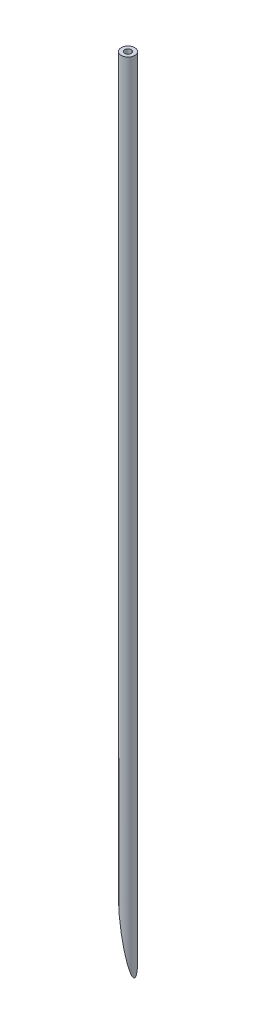
ISO-10303-21;
HEADER;
FILE_DESCRIPTION(('STEP AP214'),'2;1');
FILE_NAME('part.step','',(''),(''),'','','');
FILE_SCHEMA(('AUTOMOTIVE_DESIGN { 1 0 10303 214 1 1 1 1 }'));
ENDSEC;
DATA;
#1=APPLICATION_CONTEXT('core data for automotive mechanical design processes');
#2=APPLICATION_PROTOCOL_DEFINITION('international standard','automotive_design',2000,#1);
#3=PRODUCT_CONTEXT('',#1,'mechanical');
#4=PRODUCT('Part','Part','',(#3));
#5=PRODUCT_RELATED_PRODUCT_CATEGORY('part','',(#4));
#6=PRODUCT_DEFINITION_FORMATION('','',#4);
#7=PRODUCT_DEFINITION_CONTEXT('part definition',#1,'design');
#8=PRODUCT_DEFINITION('design','',#6,#7);
#9=PRODUCT_DEFINITION_SHAPE('','',#8);
#10=(LENGTH_UNIT() NAMED_UNIT(*) SI_UNIT(.MILLI.,.METRE.));
#11=(NAMED_UNIT(*) PLANE_ANGLE_UNIT() SI_UNIT($,.RADIAN.));
#12=(NAMED_UNIT(*) SI_UNIT($,.STERADIAN.) SOLID_ANGLE_UNIT());
#13=UNCERTAINTY_MEASURE_WITH_UNIT(LENGTH_MEASURE(1.E-05),#10,'distance_accuracy_value','');
#14=(GEOMETRIC_REPRESENTATION_CONTEXT(3) GLOBAL_UNCERTAINTY_ASSIGNED_CONTEXT((#13)) GLOBAL_UNIT_ASSIGNED_CONTEXT((#10,
#11,#12)) REPRESENTATION_CONTEXT('',''));
#15=CARTESIAN_POINT('',(0.,0.,0.));
#16=DIRECTION('',(0.,0.,1.));
#17=DIRECTION('',(1.,0.,0.));
#18=AXIS2_PLACEMENT_3D('',#15,#16,#17);
#19=CARTESIAN_POINT('',(0.,-30.,0.));
#20=DIRECTION('',(0.,1.,0.));
#21=DIRECTION('',(0.,0.,1.));
#22=AXIS2_PLACEMENT_3D('',#19,#20,#21);
#23=CYLINDRICAL_SURFACE('',#22,0.255);
#24=CARTESIAN_POINT('',(0.,0.,0.));
#25=DIRECTION('',(0.,1.,0.));
#26=DIRECTION('',(0.,0.,1.));
#27=AXIS2_PLACEMENT_3D('',#24,#25,#26);
#28=CIRCLE('',#27,0.255);
#29=CARTESIAN_POINT('',(0.,0.,0.255));
#30=VERTEX_POINT('',#29);
#31=EDGE_CURVE('E10',#30,#30,#28,.T.);
#32=ORIENTED_EDGE('',*,*,#31,.F.);
#33=EDGE_LOOP('',(#32));
#34=FACE_BOUND('',#33,.T.);
#35=CARTESIAN_POINT('',(0.,-28.5538231359974,0.));
#36=DIRECTION('',(-0.984807753012209,-0.173648177666923,0.));
#37=DIRECTION('',(-0.173648177666923,0.984807753012209,0.));
#38=AXIS2_PLACEMENT_3D('',#35,#36,#37);
#39=ELLIPSE('',#38,1.46848647320169,0.255);
#40=CARTESIAN_POINT('',(-0.255,-27.1076462719948,0.));
#41=VERTEX_POINT('',#40);
#42=EDGE_CURVE('E51',#41,#41,#39,.F.);
#43=ORIENTED_EDGE('',*,*,#42,.T.);
#44=EDGE_LOOP('',(#43));
#45=FACE_BOUND('',#44,.T.);
#46=ADVANCED_FACE('F38',(#34,#45),#23,.T.);
#47=CARTESIAN_POINT('',(0.,-30.,0.));
#48=DIRECTION('',(0.,1.,0.));
#49=DIRECTION('',(0.,0.,1.));
#50=AXIS2_PLACEMENT_3D('',#47,#48,#49);
#51=CYLINDRICAL_SURFACE('',#50,0.125);
#52=CARTESIAN_POINT('',(0.,0.,0.));
#53=DIRECTION('',(0.,1.,0.));
#54=DIRECTION('',(0.,0.,1.));
#55=AXIS2_PLACEMENT_3D('',#52,#53,#54);
#56=CIRCLE('',#55,0.125);
#57=CARTESIAN_POINT('',(0.,0.,0.125));
#58=VERTEX_POINT('',#57);
#59=EDGE_CURVE('E46',#58,#58,#56,.T.);
#60=ORIENTED_EDGE('',*,*,#59,.T.);
#61=EDGE_LOOP('',(#60));
#62=FACE_BOUND('',#61,.T.);
#63=CARTESIAN_POINT('',(0.,-28.5538231359974,0.));
#64=DIRECTION('',(-0.984807753012209,-0.173648177666923,0.));
#65=DIRECTION('',(-0.173648177666923,0.984807753012209,0.));
#66=AXIS2_PLACEMENT_3D('',#63,#64,#65);
#67=ELLIPSE('',#66,0.719846310392984,0.125);
#68=CARTESIAN_POINT('',(-0.125,-27.8449129085452,0.));
#69=VERTEX_POINT('',#68);
#70=EDGE_CURVE('E41',#69,#69,#67,.F.);
#71=ORIENTED_EDGE('',*,*,#70,.F.);
#72=EDGE_LOOP('',(#71));
#73=FACE_BOUND('',#72,.T.);
#74=ADVANCED_FACE('F64',(#62,#73),#51,.F.);
#75=CARTESIAN_POINT('',(0.,0.,0.));
#76=DIRECTION('',(0.,1.,0.));
#77=DIRECTION('',(0.,0.,1.));
#78=AXIS2_PLACEMENT_3D('',#75,#76,#77);
#79=PLANE('',#78);
#80=ORIENTED_EDGE('',*,*,#59,.F.);
#81=EDGE_LOOP('',(#80));
#82=FACE_BOUND('',#81,.T.);
#83=ORIENTED_EDGE('',*,*,#31,.T.);
#84=EDGE_LOOP('',(#83));
#85=FACE_BOUND('',#84,.T.);
#86=ADVANCED_FACE('F66',(#82,#85),#79,.T.);
#87=CARTESIAN_POINT('',(0.255,-30.,11.));
#88=DIRECTION('',(-0.984807753012209,-0.173648177666923,0.));
#89=DIRECTION('',(0.173648177666923,-0.984807753012209,0.));
#90=AXIS2_PLACEMENT_3D('',#87,#88,#89);
#91=PLANE('',#90);
#92=ORIENTED_EDGE('',*,*,#42,.F.);
#93=EDGE_LOOP('',(#92));
#94=FACE_BOUND('',#93,.T.);
#95=ORIENTED_EDGE('',*,*,#70,.T.);
#96=EDGE_LOOP('',(#95));
#97=FACE_BOUND('',#96,.T.);
#98=ADVANCED_FACE('F62',(#94,#97),#91,.T.);
#99=CLOSED_SHELL('',(#46,#74,#86,#98));
#100=MANIFOLD_SOLID_BREP('B2',#99);
#101=ADVANCED_BREP_SHAPE_REPRESENTATION('',(#18,#100),#14);
#102=SHAPE_DEFINITION_REPRESENTATION(#9,#101);
ENDSEC;
END-ISO-10303-21;
